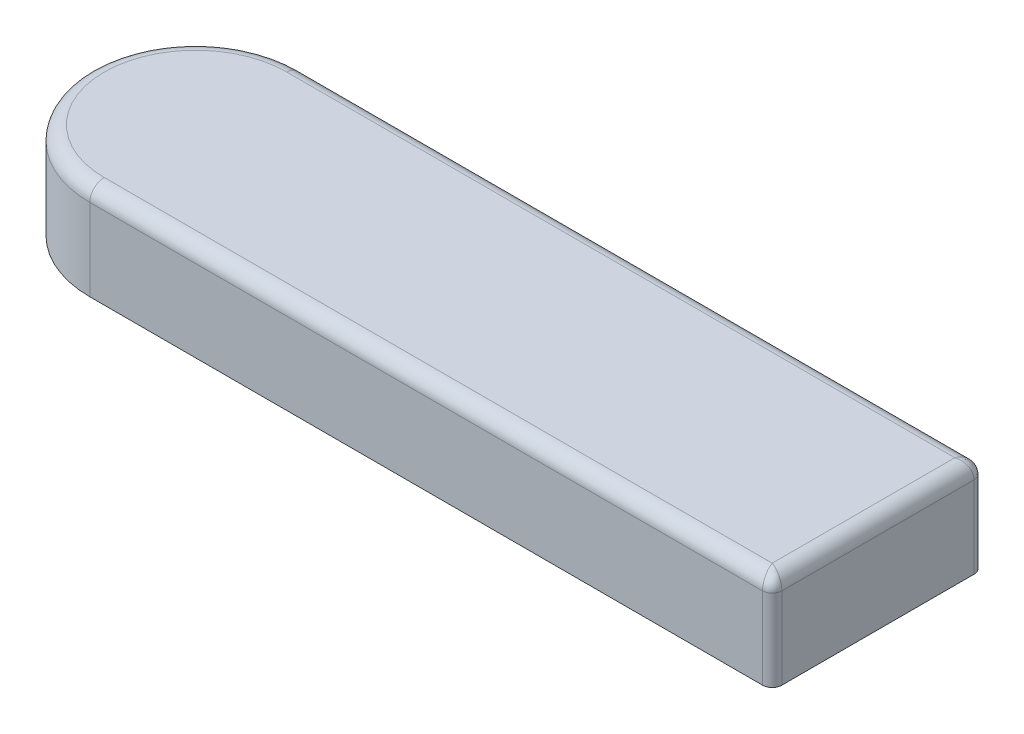
ISO-10303-21;
HEADER;
FILE_DESCRIPTION(('STEP AP214'),'2;1');
FILE_NAME('part.step','',(''),(''),'','','');
FILE_SCHEMA(('AUTOMOTIVE_DESIGN { 1 0 10303 214 1 1 1 1 }'));
ENDSEC;
DATA;
#1=APPLICATION_CONTEXT('core data for automotive mechanical design processes');
#2=APPLICATION_PROTOCOL_DEFINITION('international standard','automotive_design',2000,#1);
#3=PRODUCT_CONTEXT('',#1,'mechanical');
#4=PRODUCT('Part','Part','',(#3));
#5=PRODUCT_RELATED_PRODUCT_CATEGORY('part','',(#4));
#6=PRODUCT_DEFINITION_FORMATION('','',#4);
#7=PRODUCT_DEFINITION_CONTEXT('part definition',#1,'design');
#8=PRODUCT_DEFINITION('design','',#6,#7);
#9=PRODUCT_DEFINITION_SHAPE('','',#8);
#10=(LENGTH_UNIT() NAMED_UNIT(*) SI_UNIT(.MILLI.,.METRE.));
#11=(NAMED_UNIT(*) PLANE_ANGLE_UNIT() SI_UNIT($,.RADIAN.));
#12=(NAMED_UNIT(*) SI_UNIT($,.STERADIAN.) SOLID_ANGLE_UNIT());
#13=UNCERTAINTY_MEASURE_WITH_UNIT(LENGTH_MEASURE(1.E-05),#10,'distance_accuracy_value','');
#14=(GEOMETRIC_REPRESENTATION_CONTEXT(3) GLOBAL_UNCERTAINTY_ASSIGNED_CONTEXT((#13)) GLOBAL_UNIT_ASSIGNED_CONTEXT((#10,
#11,#12)) REPRESENTATION_CONTEXT('',''));
#15=CARTESIAN_POINT('',(0.,0.,0.));
#16=DIRECTION('',(0.,0.,1.));
#17=DIRECTION('',(1.,0.,0.));
#18=AXIS2_PLACEMENT_3D('',#15,#16,#17);
#19=CARTESIAN_POINT('',(0.,10.,0.));
#20=DIRECTION('',(0.,-1.,0.));
#21=DIRECTION('',(0.,0.,-1.));
#22=AXIS2_PLACEMENT_3D('',#19,#20,#21);
#23=CYLINDRICAL_SURFACE('',#22,10.);
#24=DIRECTION('',(0.,-1.,0.));
#25=VECTOR('',#24,1.);
#26=CARTESIAN_POINT('',(0.,10.,-10.));
#27=LINE('',#26,#25);
#28=CARTESIAN_POINT('',(0.,9.,-10.));
#29=VERTEX_POINT('',#28);
#30=CARTESIAN_POINT('',(0.,0.,-10.));
#31=VERTEX_POINT('',#30);
#32=EDGE_CURVE('E160',#29,#31,#27,.T.);
#33=ORIENTED_EDGE('',*,*,#32,.F.);
#34=CARTESIAN_POINT('',(0.,9.,0.));
#35=DIRECTION('',(0.,1.,0.));
#36=DIRECTION('',(0.,0.,1.));
#37=AXIS2_PLACEMENT_3D('',#34,#35,#36);
#38=CIRCLE('',#37,10.);
#39=CARTESIAN_POINT('',(0.,9.,10.));
#40=VERTEX_POINT('',#39);
#41=EDGE_CURVE('E139',#29,#40,#38,.T.);
#42=ORIENTED_EDGE('',*,*,#41,.T.);
#43=DIRECTION('',(0.,-1.,0.));
#44=VECTOR('',#43,1.);
#45=CARTESIAN_POINT('',(0.,10.,10.));
#46=LINE('',#45,#44);
#47=CARTESIAN_POINT('',(0.,0.,10.));
#48=VERTEX_POINT('',#47);
#49=EDGE_CURVE('E162',#40,#48,#46,.T.);
#50=ORIENTED_EDGE('',*,*,#49,.T.);
#51=CARTESIAN_POINT('',(0.,0.,0.));
#52=DIRECTION('',(0.,1.,0.));
#53=DIRECTION('',(0.,0.,1.));
#54=AXIS2_PLACEMENT_3D('',#51,#52,#53);
#55=CIRCLE('',#54,10.);
#56=EDGE_CURVE('E335',#31,#48,#55,.T.);
#57=ORIENTED_EDGE('',*,*,#56,.F.);
#58=EDGE_LOOP('',(#33,#42,#50,#57));
#59=FACE_BOUND('',#58,.T.);
#60=ADVANCED_FACE('F42',(#59),#23,.F.);
#61=CARTESIAN_POINT('',(0.,10.,10.));
#62=DIRECTION('',(0.,0.,-1.));
#63=DIRECTION('',(-1.,0.,0.));
#64=AXIS2_PLACEMENT_3D('',#61,#62,#63);
#65=PLANE('',#64);
#66=ORIENTED_EDGE('',*,*,#49,.F.);
#67=DIRECTION('',(1.,0.,0.));
#68=VECTOR('',#67,1.);
#69=CARTESIAN_POINT('',(0.,9.,10.));
#70=LINE('',#69,#68);
#71=CARTESIAN_POINT('',(70.,9.,10.));
#72=VERTEX_POINT('',#71);
#73=EDGE_CURVE('E153',#40,#72,#70,.T.);
#74=ORIENTED_EDGE('',*,*,#73,.T.);
#75=DIRECTION('',(0.,-1.,0.));
#76=VECTOR('',#75,1.);
#77=CARTESIAN_POINT('',(70.,10.,10.));
#78=LINE('',#77,#76);
#79=CARTESIAN_POINT('',(70.,0.,10.));
#80=VERTEX_POINT('',#79);
#81=EDGE_CURVE('E152',#72,#80,#78,.T.);
#82=ORIENTED_EDGE('',*,*,#81,.T.);
#83=DIRECTION('',(1.,0.,0.));
#84=VECTOR('',#83,1.);
#85=CARTESIAN_POINT('',(0.,0.,10.));
#86=LINE('',#85,#84);
#87=EDGE_CURVE('E338',#48,#80,#86,.T.);
#88=ORIENTED_EDGE('',*,*,#87,.F.);
#89=EDGE_LOOP('',(#66,#74,#82,#88));
#90=FACE_BOUND('',#89,.T.);
#91=ADVANCED_FACE('F270',(#90),#65,.T.);
#92=CARTESIAN_POINT('',(70.,10.,10.));
#93=DIRECTION('',(-1.,0.,0.));
#94=DIRECTION('',(0.,0.,1.));
#95=AXIS2_PLACEMENT_3D('',#92,#93,#94);
#96=PLANE('',#95);
#97=ORIENTED_EDGE('',*,*,#81,.F.);
#98=DIRECTION('',(0.,0.,-1.));
#99=VECTOR('',#98,1.);
#100=CARTESIAN_POINT('',(70.,9.,10.));
#101=LINE('',#100,#99);
#102=CARTESIAN_POINT('',(70.,9.,-10.));
#103=VERTEX_POINT('',#102);
#104=EDGE_CURVE('E136',#72,#103,#101,.T.);
#105=ORIENTED_EDGE('',*,*,#104,.T.);
#106=DIRECTION('',(0.,-1.,0.));
#107=VECTOR('',#106,1.);
#108=CARTESIAN_POINT('',(70.,10.,-10.));
#109=LINE('',#108,#107);
#110=CARTESIAN_POINT('',(70.,0.,-10.));
#111=VERTEX_POINT('',#110);
#112=EDGE_CURVE('E150',#103,#111,#109,.T.);
#113=ORIENTED_EDGE('',*,*,#112,.T.);
#114=DIRECTION('',(0.,0.,-1.));
#115=VECTOR('',#114,1.);
#116=CARTESIAN_POINT('',(70.,0.,10.));
#117=LINE('',#116,#115);
#118=EDGE_CURVE('E341',#80,#111,#117,.T.);
#119=ORIENTED_EDGE('',*,*,#118,.F.);
#120=EDGE_LOOP('',(#97,#105,#113,#119));
#121=FACE_BOUND('',#120,.T.);
#122=ADVANCED_FACE('F148',(#121),#96,.T.);
#123=CARTESIAN_POINT('',(0.,10.,-10.));
#124=DIRECTION('',(0.,0.,1.));
#125=DIRECTION('',(1.,0.,0.));
#126=AXIS2_PLACEMENT_3D('',#123,#124,#125);
#127=PLANE('',#126);
#128=ORIENTED_EDGE('',*,*,#112,.F.);
#129=DIRECTION('',(-1.,0.,0.));
#130=VECTOR('',#129,1.);
#131=CARTESIAN_POINT('',(0.,9.,-10.));
#132=LINE('',#131,#130);
#133=EDGE_CURVE('E133',#103,#29,#132,.T.);
#134=ORIENTED_EDGE('',*,*,#133,.T.);
#135=ORIENTED_EDGE('',*,*,#32,.T.);
#136=DIRECTION('',(-1.,0.,0.));
#137=VECTOR('',#136,1.);
#138=CARTESIAN_POINT('',(0.,0.,-10.));
#139=LINE('',#138,#137);
#140=EDGE_CURVE('E158',#111,#31,#139,.T.);
#141=ORIENTED_EDGE('',*,*,#140,.F.);
#142=EDGE_LOOP('',(#128,#134,#135,#141));
#143=FACE_BOUND('',#142,.T.);
#144=ADVANCED_FACE('F156',(#143),#127,.T.);
#145=CARTESIAN_POINT('',(0.,10.,0.));
#146=DIRECTION('',(0.,1.,0.));
#147=DIRECTION('',(0.,0.,1.));
#148=AXIS2_PLACEMENT_3D('',#145,#146,#147);
#149=PLANE('',#148);
#150=DIRECTION('',(0.,0.,-1.));
#151=VECTOR('',#150,1.);
#152=CARTESIAN_POINT('',(69.5,10.,-11.));
#153=LINE('',#152,#151);
#154=CARTESIAN_POINT('',(69.5,10.,9.5));
#155=VERTEX_POINT('',#154);
#156=CARTESIAN_POINT('',(69.5,10.,-9.5));
#157=VERTEX_POINT('',#156);
#158=EDGE_CURVE('E183',#155,#157,#153,.T.);
#159=ORIENTED_EDGE('',*,*,#158,.T.);
#160=DIRECTION('',(-1.,0.,0.));
#161=VECTOR('',#160,1.);
#162=CARTESIAN_POINT('',(0.,10.,-9.5));
#163=LINE('',#162,#161);
#164=CARTESIAN_POINT('',(0.,10.,-9.5));
#165=VERTEX_POINT('',#164);
#166=EDGE_CURVE('E188',#157,#165,#163,.T.);
#167=ORIENTED_EDGE('',*,*,#166,.T.);
#168=CARTESIAN_POINT('',(0.,10.,0.));
#169=DIRECTION('',(0.,1.,0.));
#170=DIRECTION('',(0.,0.,1.));
#171=AXIS2_PLACEMENT_3D('',#168,#169,#170);
#172=CIRCLE('',#171,9.5);
#173=CARTESIAN_POINT('',(0.,10.,9.5));
#174=VERTEX_POINT('',#173);
#175=EDGE_CURVE('E186',#165,#174,#172,.T.);
#176=ORIENTED_EDGE('',*,*,#175,.T.);
#177=DIRECTION('',(1.,0.,0.));
#178=VECTOR('',#177,1.);
#179=CARTESIAN_POINT('',(71.,10.,9.5));
#180=LINE('',#179,#178);
#181=EDGE_CURVE('E143',#174,#155,#180,.T.);
#182=ORIENTED_EDGE('',*,*,#181,.T.);
#183=EDGE_LOOP('',(#159,#167,#176,#182));
#184=FACE_BOUND('',#183,.T.);
#185=ADVANCED_FACE('F280',(#184),#149,.T.);
#186=CARTESIAN_POINT('',(0.,0.,0.));
#187=DIRECTION('',(0.,1.,0.));
#188=DIRECTION('',(0.,0.,1.));
#189=AXIS2_PLACEMENT_3D('',#186,#187,#188);
#190=PLANE('',#189);
#191=DIRECTION('',(-1.,0.,0.));
#192=VECTOR('',#191,1.);
#193=CARTESIAN_POINT('',(0.,0.,-11.));
#194=LINE('',#193,#192);
#195=CARTESIAN_POINT('',(70.,0.,-11.));
#196=VERTEX_POINT('',#195);
#197=CARTESIAN_POINT('',(0.,0.,-11.));
#198=VERTEX_POINT('',#197);
#199=EDGE_CURVE('E175',#196,#198,#194,.T.);
#200=ORIENTED_EDGE('',*,*,#199,.F.);
#201=CARTESIAN_POINT('',(70.,0.,-10.));
#202=DIRECTION('',(0.,1.,0.));
#203=DIRECTION('',(0.,0.,1.));
#204=AXIS2_PLACEMENT_3D('',#201,#202,#203);
#205=CIRCLE('',#204,1.);
#206=CARTESIAN_POINT('',(71.,0.,-10.));
#207=VERTEX_POINT('',#206);
#208=EDGE_CURVE('E64',#196,#207,#205,.F.);
#209=ORIENTED_EDGE('',*,*,#208,.T.);
#210=DIRECTION('',(0.,0.,-1.));
#211=VECTOR('',#210,1.);
#212=CARTESIAN_POINT('',(71.,0.,-11.));
#213=LINE('',#212,#211);
#214=CARTESIAN_POINT('',(71.,0.,10.));
#215=VERTEX_POINT('',#214);
#216=EDGE_CURVE('E173',#215,#207,#213,.T.);
#217=ORIENTED_EDGE('',*,*,#216,.F.);
#218=CARTESIAN_POINT('',(70.,0.,10.));
#219=DIRECTION('',(0.,1.,0.));
#220=DIRECTION('',(0.,0.,1.));
#221=AXIS2_PLACEMENT_3D('',#218,#219,#220);
#222=CIRCLE('',#221,1.);
#223=CARTESIAN_POINT('',(70.,0.,11.));
#224=VERTEX_POINT('',#223);
#225=EDGE_CURVE('E58',#215,#224,#222,.F.);
#226=ORIENTED_EDGE('',*,*,#225,.T.);
#227=DIRECTION('',(1.,0.,0.));
#228=VECTOR('',#227,1.);
#229=CARTESIAN_POINT('',(0.,0.,11.));
#230=LINE('',#229,#228);
#231=CARTESIAN_POINT('',(0.,0.,11.));
#232=VERTEX_POINT('',#231);
#233=EDGE_CURVE('E171',#232,#224,#230,.T.);
#234=ORIENTED_EDGE('',*,*,#233,.F.);
#235=CARTESIAN_POINT('',(0.,0.,0.));
#236=DIRECTION('',(0.,1.,0.));
#237=DIRECTION('',(0.,0.,1.));
#238=AXIS2_PLACEMENT_3D('',#235,#236,#237);
#239=CIRCLE('',#238,11.);
#240=EDGE_CURVE('E168',#198,#232,#239,.T.);
#241=ORIENTED_EDGE('',*,*,#240,.F.);
#242=EDGE_LOOP('',(#200,#209,#217,#226,#234,#241));
#243=FACE_BOUND('',#242,.T.);
#244=ORIENTED_EDGE('',*,*,#56,.T.);
#245=ORIENTED_EDGE('',*,*,#87,.T.);
#246=ORIENTED_EDGE('',*,*,#118,.T.);
#247=ORIENTED_EDGE('',*,*,#140,.T.);
#248=EDGE_LOOP('',(#244,#245,#246,#247));
#249=FACE_BOUND('',#248,.T.);
#250=ADVANCED_FACE('F283',(#243,#249),#190,.F.);
#251=CARTESIAN_POINT('',(0.,10.,0.));
#252=DIRECTION('',(0.,-1.,0.));
#253=DIRECTION('',(0.,0.,-1.));
#254=AXIS2_PLACEMENT_3D('',#251,#252,#253);
#255=CYLINDRICAL_SURFACE('',#254,11.);
#256=DIRECTION('',(0.,-1.,0.));
#257=VECTOR('',#256,1.);
#258=CARTESIAN_POINT('',(0.,10.,11.));
#259=LINE('',#258,#257);
#260=CARTESIAN_POINT('',(0.,8.5,11.));
#261=VERTEX_POINT('',#260);
#262=EDGE_CURVE('E144',#261,#232,#259,.T.);
#263=ORIENTED_EDGE('',*,*,#262,.F.);
#264=CARTESIAN_POINT('',(0.,8.5,0.));
#265=DIRECTION('',(0.,1.,0.));
#266=DIRECTION('',(0.,0.,1.));
#267=AXIS2_PLACEMENT_3D('',#264,#265,#266);
#268=CIRCLE('',#267,11.);
#269=CARTESIAN_POINT('',(0.,8.5,-11.));
#270=VERTEX_POINT('',#269);
#271=EDGE_CURVE('E194',#261,#270,#268,.F.);
#272=ORIENTED_EDGE('',*,*,#271,.T.);
#273=DIRECTION('',(0.,-1.,0.));
#274=VECTOR('',#273,1.);
#275=CARTESIAN_POINT('',(0.,10.,-11.));
#276=LINE('',#275,#274);
#277=EDGE_CURVE('E177',#270,#198,#276,.T.);
#278=ORIENTED_EDGE('',*,*,#277,.T.);
#279=ORIENTED_EDGE('',*,*,#240,.T.);
#280=EDGE_LOOP('',(#263,#272,#278,#279));
#281=FACE_BOUND('',#280,.T.);
#282=ADVANCED_FACE('F287',(#281),#255,.T.);
#283=CARTESIAN_POINT('',(0.,10.,11.));
#284=DIRECTION('',(0.,0.,-1.));
#285=DIRECTION('',(-1.,0.,0.));
#286=AXIS2_PLACEMENT_3D('',#283,#284,#285);
#287=PLANE('',#286);
#288=ORIENTED_EDGE('',*,*,#233,.T.);
#289=DIRECTION('',(0.,-1.,0.));
#290=VECTOR('',#289,1.);
#291=CARTESIAN_POINT('',(70.,10.,11.));
#292=LINE('',#291,#290);
#293=CARTESIAN_POINT('',(70.,8.5,11.));
#294=VERTEX_POINT('',#293);
#295=EDGE_CURVE('E224',#224,#294,#292,.F.);
#296=ORIENTED_EDGE('',*,*,#295,.T.);
#297=DIRECTION('',(1.,0.,0.));
#298=VECTOR('',#297,1.);
#299=CARTESIAN_POINT('',(0.,8.5,11.));
#300=LINE('',#299,#298);
#301=EDGE_CURVE('E199',#294,#261,#300,.F.);
#302=ORIENTED_EDGE('',*,*,#301,.T.);
#303=ORIENTED_EDGE('',*,*,#262,.T.);
#304=EDGE_LOOP('',(#288,#296,#302,#303));
#305=FACE_BOUND('',#304,.T.);
#306=ADVANCED_FACE('F295',(#305),#287,.F.);
#307=CARTESIAN_POINT('',(71.,10.,-11.));
#308=DIRECTION('',(-1.,0.,0.));
#309=DIRECTION('',(0.,0.,1.));
#310=AXIS2_PLACEMENT_3D('',#307,#308,#309);
#311=PLANE('',#310);
#312=ORIENTED_EDGE('',*,*,#216,.T.);
#313=DIRECTION('',(0.,-1.,0.));
#314=VECTOR('',#313,1.);
#315=CARTESIAN_POINT('',(71.,10.,-10.));
#316=LINE('',#315,#314);
#317=CARTESIAN_POINT('',(71.,8.5,-10.));
#318=VERTEX_POINT('',#317);
#319=EDGE_CURVE('E222',#207,#318,#316,.F.);
#320=ORIENTED_EDGE('',*,*,#319,.T.);
#321=DIRECTION('',(0.,0.,-1.));
#322=VECTOR('',#321,1.);
#323=CARTESIAN_POINT('',(71.,8.5,11.));
#324=LINE('',#323,#322);
#325=CARTESIAN_POINT('',(71.,8.5,10.));
#326=VERTEX_POINT('',#325);
#327=EDGE_CURVE('E196',#318,#326,#324,.F.);
#328=ORIENTED_EDGE('',*,*,#327,.T.);
#329=DIRECTION('',(0.,-1.,0.));
#330=VECTOR('',#329,1.);
#331=CARTESIAN_POINT('',(71.,10.,10.));
#332=LINE('',#331,#330);
#333=EDGE_CURVE('E220',#326,#215,#332,.T.);
#334=ORIENTED_EDGE('',*,*,#333,.T.);
#335=EDGE_LOOP('',(#312,#320,#328,#334));
#336=FACE_BOUND('',#335,.T.);
#337=ADVANCED_FACE('F291',(#336),#311,.F.);
#338=CARTESIAN_POINT('',(0.,10.,-11.));
#339=DIRECTION('',(0.,0.,1.));
#340=DIRECTION('',(1.,0.,0.));
#341=AXIS2_PLACEMENT_3D('',#338,#339,#340);
#342=PLANE('',#341);
#343=DIRECTION('',(-1.,0.,0.));
#344=VECTOR('',#343,1.);
#345=CARTESIAN_POINT('',(71.,8.5,-11.));
#346=LINE('',#345,#344);
#347=CARTESIAN_POINT('',(70.,8.5,-11.));
#348=VERTEX_POINT('',#347);
#349=EDGE_CURVE('E191',#270,#348,#346,.F.);
#350=ORIENTED_EDGE('',*,*,#349,.T.);
#351=DIRECTION('',(0.,-1.,0.));
#352=VECTOR('',#351,1.);
#353=CARTESIAN_POINT('',(70.,10.,-11.));
#354=LINE('',#353,#352);
#355=EDGE_CURVE('E216',#348,#196,#354,.T.);
#356=ORIENTED_EDGE('',*,*,#355,.T.);
#357=ORIENTED_EDGE('',*,*,#199,.T.);
#358=ORIENTED_EDGE('',*,*,#277,.F.);
#359=EDGE_LOOP('',(#350,#356,#357,#358));
#360=FACE_BOUND('',#359,.T.);
#361=ADVANCED_FACE('F288',(#360),#342,.F.);
#362=CARTESIAN_POINT('',(0.,9.,0.));
#363=DIRECTION('',(0.,1.,0.));
#364=DIRECTION('',(0.,0.,1.));
#365=AXIS2_PLACEMENT_3D('',#362,#363,#364);
#366=PLANE('',#365);
#367=CARTESIAN_POINT('',(58.57,9.,0.));
#368=DIRECTION('',(0.,1.,0.));
#369=DIRECTION('',(0.,0.,1.));
#370=AXIS2_PLACEMENT_3D('',#367,#368,#369);
#371=CIRCLE('',#370,7.50000000000001);
#372=CARTESIAN_POINT('',(58.57,9.,7.50000000000001));
#373=VERTEX_POINT('',#372);
#374=EDGE_CURVE('E46',#373,#373,#371,.F.);
#375=ORIENTED_EDGE('',*,*,#374,.F.);
#376=EDGE_LOOP('',(#375));
#377=FACE_BOUND('',#376,.T.);
#378=ORIENTED_EDGE('',*,*,#41,.F.);
#379=ORIENTED_EDGE('',*,*,#133,.F.);
#380=ORIENTED_EDGE('',*,*,#104,.F.);
#381=ORIENTED_EDGE('',*,*,#73,.F.);
#382=EDGE_LOOP('',(#378,#379,#380,#381));
#383=FACE_BOUND('',#382,.T.);
#384=ADVANCED_FACE('F135',(#377,#383),#366,.F.);
#385=CARTESIAN_POINT('',(0.,8.5,9.5));
#386=DIRECTION('',(-1.,0.,0.));
#387=DIRECTION('',(0.,0.,1.));
#388=AXIS2_PLACEMENT_3D('',#385,#386,#387);
#389=CYLINDRICAL_SURFACE('',#388,1.5);
#390=ORIENTED_EDGE('',*,*,#301,.F.);
#391=CARTESIAN_POINT('',(69.5,8.5,9.5));
#392=DIRECTION('',(0.948683298050513,0.,-0.316227766016838));
#393=DIRECTION('',(0.316227766016838,0.,0.948683298050514));
#394=AXIS2_PLACEMENT_3D('',#391,#392,#393);
#395=ELLIPSE('',#394,1.58113883008419,1.5);
#396=EDGE_CURVE('E214',#294,#155,#395,.F.);
#397=ORIENTED_EDGE('',*,*,#396,.T.);
#398=ORIENTED_EDGE('',*,*,#181,.F.);
#399=CARTESIAN_POINT('',(0.,8.5,9.5));
#400=DIRECTION('',(-1.,0.,0.));
#401=DIRECTION('',(0.,-1.,0.));
#402=AXIS2_PLACEMENT_3D('',#399,#400,#401);
#403=CIRCLE('',#402,1.5);
#404=EDGE_CURVE('E154',#261,#174,#403,.T.);
#405=ORIENTED_EDGE('',*,*,#404,.F.);
#406=EDGE_LOOP('',(#390,#397,#398,#405));
#407=FACE_BOUND('',#406,.T.);
#408=ADVANCED_FACE('F241',(#407),#389,.T.);
#409=CARTESIAN_POINT('',(69.5,8.5,0.));
#410=DIRECTION('',(0.,0.,1.));
#411=DIRECTION('',(1.,0.,0.));
#412=AXIS2_PLACEMENT_3D('',#409,#410,#411);
#413=CYLINDRICAL_SURFACE('',#412,1.5);
#414=ORIENTED_EDGE('',*,*,#327,.F.);
#415=CARTESIAN_POINT('',(69.5,8.5,-9.5));
#416=DIRECTION('',(-0.316227766016838,0.,-0.948683298050514));
#417=DIRECTION('',(0.948683298050514,0.,-0.316227766016838));
#418=AXIS2_PLACEMENT_3D('',#415,#416,#417);
#419=ELLIPSE('',#418,1.58113883008419,1.5);
#420=EDGE_CURVE('E212',#318,#157,#419,.F.);
#421=ORIENTED_EDGE('',*,*,#420,.T.);
#422=ORIENTED_EDGE('',*,*,#158,.F.);
#423=CARTESIAN_POINT('',(69.5,8.5,9.5));
#424=DIRECTION('',(0.316227766016838,0.,-0.948683298050514));
#425=DIRECTION('',(0.948683298050514,0.,0.316227766016838));
#426=AXIS2_PLACEMENT_3D('',#423,#424,#425);
#427=ELLIPSE('',#426,1.58113883008419,1.5);
#428=EDGE_CURVE('E209',#155,#326,#427,.T.);
#429=ORIENTED_EDGE('',*,*,#428,.T.);
#430=EDGE_LOOP('',(#414,#421,#422,#429));
#431=FACE_BOUND('',#430,.T.);
#432=ADVANCED_FACE('F247',(#431),#413,.T.);
#433=CARTESIAN_POINT('',(0.,8.5,0.));
#434=DIRECTION('',(0.,1.,0.));
#435=DIRECTION('',(0.,0.,1.));
#436=AXIS2_PLACEMENT_3D('',#433,#434,#435);
#437=TOROIDAL_SURFACE('',#436,9.5,1.5);
#438=ORIENTED_EDGE('',*,*,#404,.T.);
#439=ORIENTED_EDGE('',*,*,#175,.F.);
#440=CARTESIAN_POINT('',(0.,8.5,-9.5));
#441=DIRECTION('',(1.,0.,0.));
#442=DIRECTION('',(0.,0.,-1.));
#443=AXIS2_PLACEMENT_3D('',#440,#441,#442);
#444=CIRCLE('',#443,1.5);
#445=EDGE_CURVE('E202',#270,#165,#444,.T.);
#446=ORIENTED_EDGE('',*,*,#445,.F.);
#447=ORIENTED_EDGE('',*,*,#271,.F.);
#448=EDGE_LOOP('',(#438,#439,#446,#447));
#449=FACE_BOUND('',#448,.T.);
#450=ADVANCED_FACE('F250',(#449),#437,.T.);
#451=CARTESIAN_POINT('',(0.,8.5,-9.5));
#452=DIRECTION('',(1.,0.,0.));
#453=DIRECTION('',(0.,0.,-1.));
#454=AXIS2_PLACEMENT_3D('',#451,#452,#453);
#455=CYLINDRICAL_SURFACE('',#454,1.5);
#456=ORIENTED_EDGE('',*,*,#166,.F.);
#457=CARTESIAN_POINT('',(69.5,8.5,-9.5));
#458=DIRECTION('',(-0.948683298050513,0.,-0.316227766016838));
#459=DIRECTION('',(0.316227766016838,0.,-0.948683298050514));
#460=AXIS2_PLACEMENT_3D('',#457,#458,#459);
#461=ELLIPSE('',#460,1.58113883008419,1.5);
#462=EDGE_CURVE('E201',#157,#348,#461,.T.);
#463=ORIENTED_EDGE('',*,*,#462,.T.);
#464=ORIENTED_EDGE('',*,*,#349,.F.);
#465=ORIENTED_EDGE('',*,*,#445,.T.);
#466=EDGE_LOOP('',(#456,#463,#464,#465));
#467=FACE_BOUND('',#466,.T.);
#468=ADVANCED_FACE('F243',(#467),#455,.T.);
#469=CARTESIAN_POINT('',(70.,10.,-10.));
#470=DIRECTION('',(0.,-1.,0.));
#471=DIRECTION('',(0.,0.,-1.));
#472=AXIS2_PLACEMENT_3D('',#469,#470,#471);
#473=CYLINDRICAL_SURFACE('',#472,1.);
#474=ORIENTED_EDGE('',*,*,#208,.F.);
#475=ORIENTED_EDGE('',*,*,#355,.F.);
#476=CARTESIAN_POINT('',(70.,8.5,-10.));
#477=DIRECTION('',(0.,1.,0.));
#478=DIRECTION('',(0.,0.,1.));
#479=AXIS2_PLACEMENT_3D('',#476,#477,#478);
#480=CIRCLE('',#479,1.);
#481=EDGE_CURVE('E204',#318,#348,#480,.T.);
#482=ORIENTED_EDGE('',*,*,#481,.F.);
#483=ORIENTED_EDGE('',*,*,#319,.F.);
#484=EDGE_LOOP('',(#474,#475,#482,#483));
#485=FACE_BOUND('',#484,.T.);
#486=ADVANCED_FACE('F239',(#485),#473,.T.);
#487=CARTESIAN_POINT('',(69.5,7.,-9.5));
#488=CARTESIAN_POINT('',(69.5,7.,-9.5));
#489=CARTESIAN_POINT('',(69.5,7.,-9.5));
#490=CARTESIAN_POINT('',(69.5217823735519,7.00002629143751,-9.56534712065569));
#491=CARTESIAN_POINT('',(69.5435728143365,7.00004019665682,-9.54357281433653));
#492=CARTESIAN_POINT('',(69.5653471206557,7.00002629143751,-9.5217823735519));
#493=CARTESIAN_POINT('',(69.5435703088954,7.00427236557313,-9.63071092668624));
#494=CARTESIAN_POINT('',(69.5872665803194,7.00142852337514,-9.58726658031936));
#495=CARTESIAN_POINT('',(69.6307109266862,7.00427236557313,-9.54357030889541));
#496=CARTESIAN_POINT('',(69.5867714969681,7.02132028831667,-9.76031449090427));
#497=CARTESIAN_POINT('',(69.674782714425,7.00719223269811,-9.67478271442495));
#498=CARTESIAN_POINT('',(69.7603144909043,7.02132028831668,-9.58677149696809));
#499=CARTESIAN_POINT('',(69.6081863603207,7.03404910699136,-9.82455908096205));
#500=CARTESIAN_POINT('',(69.7188522333018,7.01157542738237,-9.71885223330176));
#501=CARTESIAN_POINT('',(69.8245590809621,7.03404910699136,-9.60818636032069));
#502=CARTESIAN_POINT('',(69.6502767096491,7.06788723141722,-9.95083012894728));
#503=CARTESIAN_POINT('',(69.8075048536816,7.02366590745903,-9.80750485368162));
#504=CARTESIAN_POINT('',(69.9508301289473,7.06788723141722,-9.65027670964909));
#505=CARTESIAN_POINT('',(69.6709585724816,7.08885239061663,-10.0128757174448));
#506=CARTESIAN_POINT('',(69.8523318832769,7.03138816939872,-9.85233188327694));
#507=CARTESIAN_POINT('',(70.0128757174448,7.08885239061663,-9.67095857248161));
#508=CARTESIAN_POINT('',(69.7112227334933,7.13888506426985,-10.13366820048));
#509=CARTESIAN_POINT('',(69.9428936210717,7.05090326474452,-9.9428936210717));
#510=CARTESIAN_POINT('',(70.13366820048,7.13888506426985,-9.71122273349334));
#511=CARTESIAN_POINT('',(69.7308195679233,7.16774025933576,-10.19245870377));
#512=CARTESIAN_POINT('',(69.9888635766674,7.06271478363326,-9.9888635766674));
#513=CARTESIAN_POINT('',(70.19245870377,7.16774025933576,-9.73081956792333));
#514=CARTESIAN_POINT('',(69.76856991767,7.23312608249779,-10.3057097530099));
#515=CARTESIAN_POINT('',(70.0820627393204,7.09161741746887,-10.0820627393204));
#516=CARTESIAN_POINT('',(70.3057097530099,7.2331260824978,-9.76856991766997));
#517=CARTESIAN_POINT('',(69.7867495193356,7.26938316632966,-10.3602485580067));
#518=CARTESIAN_POINT('',(70.1295106306281,7.10872415201272,-10.1295106306281));
#519=CARTESIAN_POINT('',(70.3602485580067,7.26938316632967,-9.78674951933556));
#520=CARTESIAN_POINT('',(69.8213420383227,7.34901477609246,-10.4640261149682));
#521=CARTESIAN_POINT('',(70.22584714471,7.15007114450488,-10.22584714471));
#522=CARTESIAN_POINT('',(70.4640261149682,7.34901477609247,-9.82134203832273));
#523=CARTESIAN_POINT('',(69.8377958358128,7.39206654786685,-10.5133875074385));
#524=CARTESIAN_POINT('',(70.2749250131566,7.17430962593363,-10.2749250131566));
#525=CARTESIAN_POINT('',(70.5133875074385,7.39206654786685,-9.83779583581282));
#526=CARTESIAN_POINT('',(69.8686396401377,7.4845991666221,-10.6059189204132));
#527=CARTESIAN_POINT('',(70.3742724272084,7.23254441323452,-10.3742724272084));
#528=CARTESIAN_POINT('',(70.6059189204132,7.48459916662209,-9.86863964013773));
#529=CARTESIAN_POINT('',(69.883087706164,7.53372798496215,-10.649263118492));
#530=CARTESIAN_POINT('',(70.4246835962108,7.26649448382186,-10.4246835962108));
#531=CARTESIAN_POINT('',(70.649263118492,7.53372798496215,-9.883087706164));
#532=CARTESIAN_POINT('',(69.9096548366656,7.63759964377597,-10.7289645099968));
#533=CARTESIAN_POINT('',(70.5255819710409,7.34748701780004,-10.5255819710409));
#534=CARTESIAN_POINT('',(70.7289645099968,7.63759964377597,-9.90965483666561));
#535=CARTESIAN_POINT('',(69.9218493954006,7.69199088859271,-10.7655481862017));
#536=CARTESIAN_POINT('',(70.5761414544634,7.39439180670888,-10.5761414544634));
#537=CARTESIAN_POINT('',(70.7655481862017,7.69199088859272,-9.92184939540055));
#538=CARTESIAN_POINT('',(69.9436829907165,7.80544718973898,-10.8310489721496));
#539=CARTESIAN_POINT('',(70.6747885217409,7.50478447762643,-10.6747885217409));
#540=CARTESIAN_POINT('',(70.8310489721496,7.80544718973898,-9.94368299071653));
#541=CARTESIAN_POINT('',(69.9534111045777,7.86419974278135,-10.8602333137332));
#542=CARTESIAN_POINT('',(70.7228613759303,7.56797143857374,-10.7228613759303));
#543=CARTESIAN_POINT('',(70.8602333137332,7.86419974278134,-9.95341110457774));
#544=CARTESIAN_POINT('',(69.9701326318778,7.98531771006845,-10.9103978956334));
#545=CARTESIAN_POINT('',(70.8121547575071,7.71318638085784,-10.8121547575072));
#546=CARTESIAN_POINT('',(70.9103978956334,7.98531771006845,-9.97013263187781));
#547=CARTESIAN_POINT('',(69.9772186371533,8.04744979781569,-10.9316559114598));
#548=CARTESIAN_POINT('',(70.8532760697352,7.79466202463433,-10.8532760697352));
#549=CARTESIAN_POINT('',(70.9316559114598,8.04744979781569,-9.97721863715327));
#550=CARTESIAN_POINT('',(69.9885347087233,8.17416171433211,-10.9656041261701));
#551=CARTESIAN_POINT('',(70.9228683074525,7.97533536040442,-10.9228683074526));
#552=CARTESIAN_POINT('',(70.96560412617,8.17416171433211,-9.98853470872335));
#553=CARTESIAN_POINT('',(69.992844140155,8.23861202839033,-10.9785324204649));
#554=CARTESIAN_POINT('',(70.9511972894264,8.07366462123912,-10.9511972894264));
#555=CARTESIAN_POINT('',(70.9785324204649,8.23861202839033,-9.99284414015497));
#556=CARTESIAN_POINT('',(69.9985534982464,8.3687331433414,-10.9956604947392));
#557=CARTESIAN_POINT('',(70.9898159733385,8.28188671940045,-10.9898159733385));
#558=CARTESIAN_POINT('',(70.9956604947392,8.3687331433414,-9.99855349824639));
#559=CARTESIAN_POINT('',(70.,8.4343665716707,-11.));
#560=CARTESIAN_POINT('',(71.,8.39062512198593,-11.));
#561=CARTESIAN_POINT('',(71.,8.4343665716707,-10.));
#562=CARTESIAN_POINT('',(70.,8.5656334283293,-11.));
#563=CARTESIAN_POINT('',(71.,8.60937487801407,-11.));
#564=CARTESIAN_POINT('',(71.,8.5656334283293,-10.));
#565=CARTESIAN_POINT('',(69.9985534982464,8.6312668566586,-10.9956604947392));
#566=CARTESIAN_POINT('',(70.9898159733385,8.71811328059956,-10.9898159733385));
#567=CARTESIAN_POINT('',(70.9956604947392,8.63126685665861,-9.99855349824639));
#568=CARTESIAN_POINT('',(69.992844140155,8.76138797160967,-10.9785324204649));
#569=CARTESIAN_POINT('',(70.9511972894264,8.92633537876088,-10.9511972894264));
#570=CARTESIAN_POINT('',(70.9785324204649,8.76138797160967,-9.99284414015497));
#571=CARTESIAN_POINT('',(69.9885347087233,8.82583828566789,-10.9656041261701));
#572=CARTESIAN_POINT('',(70.9228683074526,9.02466463959557,-10.9228683074526));
#573=CARTESIAN_POINT('',(70.96560412617,8.82583828566789,-9.98853470872335));
#574=CARTESIAN_POINT('',(69.9772186371533,8.95255020218431,-10.9316559114598));
#575=CARTESIAN_POINT('',(70.8532760697352,9.20533797536566,-10.8532760697352));
#576=CARTESIAN_POINT('',(70.9316559114598,8.95255020218431,-9.97721863715327));
#577=CARTESIAN_POINT('',(69.9701326318778,9.01468228993155,-10.9103978956334));
#578=CARTESIAN_POINT('',(70.8121547575071,9.28681361914216,-10.8121547575072));
#579=CARTESIAN_POINT('',(70.9103978956334,9.01468228993155,-9.97013263187781));
#580=CARTESIAN_POINT('',(69.9534111045777,9.13580025721865,-10.8602333137332));
#581=CARTESIAN_POINT('',(70.7228613759303,9.43202856142627,-10.7228613759303));
#582=CARTESIAN_POINT('',(70.8602333137332,9.13580025721866,-9.95341110457774));
#583=CARTESIAN_POINT('',(69.9436829907165,9.19455281026102,-10.8310489721496));
#584=CARTESIAN_POINT('',(70.6747885217409,9.49521552237357,-10.6747885217409));
#585=CARTESIAN_POINT('',(70.8310489721496,9.19455281026102,-9.94368299071653));
#586=CARTESIAN_POINT('',(69.9218493954006,9.30800911140729,-10.7655481862017));
#587=CARTESIAN_POINT('',(70.5761414544634,9.60560819329112,-10.5761414544634));
#588=CARTESIAN_POINT('',(70.7655481862017,9.30800911140729,-9.92184939540055));
#589=CARTESIAN_POINT('',(69.9096548366656,9.36240035622404,-10.7289645099968));
#590=CARTESIAN_POINT('',(70.5255819710409,9.65251298219996,-10.5255819710409));
#591=CARTESIAN_POINT('',(70.7289645099968,9.36240035622403,-9.90965483666561));
#592=CARTESIAN_POINT('',(69.883087706164,9.46627201503785,-10.649263118492));
#593=CARTESIAN_POINT('',(70.4246835962108,9.73350551617814,-10.4246835962108));
#594=CARTESIAN_POINT('',(70.649263118492,9.46627201503785,-9.883087706164));
#595=CARTESIAN_POINT('',(69.8686396401377,9.5154008333779,-10.6059189204132));
#596=CARTESIAN_POINT('',(70.3742724272084,9.76745558676548,-10.3742724272084));
#597=CARTESIAN_POINT('',(70.6059189204132,9.51540083337791,-9.86863964013773));
#598=CARTESIAN_POINT('',(69.8377958358128,9.60793345213315,-10.5133875074385));
#599=CARTESIAN_POINT('',(70.2749250131566,9.82569037406637,-10.2749250131566));
#600=CARTESIAN_POINT('',(70.5133875074385,9.60793345213316,-9.83779583581282));
#601=CARTESIAN_POINT('',(69.8213420383227,9.65098522390754,-10.4640261149682));
#602=CARTESIAN_POINT('',(70.22584714471,9.84992885549512,-10.22584714471));
#603=CARTESIAN_POINT('',(70.4640261149682,9.65098522390754,-9.82134203832273));
#604=CARTESIAN_POINT('',(69.7867495193356,9.73061683367034,-10.3602485580067));
#605=CARTESIAN_POINT('',(70.1295106306281,9.89127584798728,-10.1295106306281));
#606=CARTESIAN_POINT('',(70.3602485580067,9.73061683367033,-9.78674951933556));
#607=CARTESIAN_POINT('',(69.76856991767,9.76687391750221,-10.3057097530099));
#608=CARTESIAN_POINT('',(70.0820627393204,9.90838258253113,-10.0820627393204));
#609=CARTESIAN_POINT('',(70.3057097530099,9.7668739175022,-9.76856991766997));
#610=CARTESIAN_POINT('',(69.7308195679233,9.83225974066424,-10.19245870377));
#611=CARTESIAN_POINT('',(69.9888635766674,9.93728521636674,-9.9888635766674));
#612=CARTESIAN_POINT('',(70.19245870377,9.83225974066424,-9.73081956792333));
#613=CARTESIAN_POINT('',(69.7112227334933,9.86111493573015,-10.13366820048));
#614=CARTESIAN_POINT('',(69.9428936210717,9.94909673525548,-9.9428936210717));
#615=CARTESIAN_POINT('',(70.13366820048,9.86111493573016,-9.71122273349334));
#616=CARTESIAN_POINT('',(69.6709585724816,9.91114760938337,-10.0128757174448));
#617=CARTESIAN_POINT('',(69.8523318832769,9.96861183060128,-9.85233188327694));
#618=CARTESIAN_POINT('',(70.0128757174448,9.91114760938337,-9.67095857248161));
#619=CARTESIAN_POINT('',(69.6502767096491,9.93211276858278,-9.95083012894728));
#620=CARTESIAN_POINT('',(69.8075048536816,9.97633409254098,-9.80750485368162));
#621=CARTESIAN_POINT('',(69.9508301289473,9.93211276858278,-9.65027670964909));
#622=CARTESIAN_POINT('',(69.6081863603207,9.96595089300865,-9.82455908096205));
#623=CARTESIAN_POINT('',(69.7188522333018,9.98842457261764,-9.71885223330176));
#624=CARTESIAN_POINT('',(69.8245590809621,9.96595089300864,-9.60818636032069));
#625=CARTESIAN_POINT('',(69.5867714969681,9.97867971168333,-9.76031449090427));
#626=CARTESIAN_POINT('',(69.674782714425,9.99280776730189,-9.67478271442495));
#627=CARTESIAN_POINT('',(69.7603144909043,9.97867971168332,-9.58677149696809));
#628=CARTESIAN_POINT('',(69.5435703088954,9.99572763442687,-9.63071092668624));
#629=CARTESIAN_POINT('',(69.5872665803194,9.99857147662486,-9.58726658031936));
#630=CARTESIAN_POINT('',(69.6307109266862,9.99572763442687,-9.54357030889541));
#631=CARTESIAN_POINT('',(69.5217823735519,9.99997370856249,-9.56534712065569));
#632=CARTESIAN_POINT('',(69.5435728143365,9.99995980334318,-9.54357281433652));
#633=CARTESIAN_POINT('',(69.5653471206557,9.99997370856249,-9.5217823735519));
#634=CARTESIAN_POINT('',(69.5,10.,-9.5));
#635=CARTESIAN_POINT('',(69.5,10.,-9.5));
#636=CARTESIAN_POINT('',(69.5,10.,-9.5));
#637=(BOUNDED_SURFACE() B_SPLINE_SURFACE(3,2,((#487,#488,#489),(#490,#491,#492),(#493,#494,
#495),(#496,#497,#498),(#499,#500,#501),(#502,#503,#504),(#505,#506,#507),(#508,#509,#510),
(#511,#512,#513),(#514,#515,#516),(#517,#518,#519),(#520,#521,#522),(#523,#524,#525),(#526,#527,
#528),(#529,#530,#531),(#532,#533,#534),(#535,#536,#537),(#538,#539,#540),(#541,#542,#543),
(#544,#545,#546),(#547,#548,#549),(#550,#551,#552),(#553,#554,#555),(#556,#557,#558),(#559,#560,
#561),(#562,#563,#564),(#565,#566,#567),(#568,#569,#570),(#571,#572,#573),(#574,#575,#576),
(#577,#578,#579),(#580,#581,#582),(#583,#584,#585),(#586,#587,#588),(#589,#590,#591),(#592,#593,
#594),(#595,#596,#597),(#598,#599,#600),(#601,#602,#603),(#604,#605,#606),(#607,#608,#609),
(#610,#611,#612),(#613,#614,#615),(#616,#617,#618),(#619,#620,#621),(#622,#623,#624),(#625,#626,
#627),(#628,#629,#630),(#631,#632,#633),(#634,#635,#636)),.UNSPECIFIED.,.F.,.F.,
.F.) B_SPLINE_SURFACE_WITH_KNOTS((4,2,2,2,2,2,2,2,2,2,2,2,2,2,2,2,2,2,2,2,2,2,2,2,4),(3,3),(0.,
0.0923950270683554,0.184004706351032,0.274077820658671,0.361932038391825,0.446989850632089,
0.528816016293444,0.607156213845177,0.681975172112349,0.753489816527182,0.822188739504234,
0.888824875354154,0.954367738522642,1.01991060169113,1.08654673754105,1.1552456605181,
1.22676030493293,1.30157926320011,1.37991946075184,1.46174562641319,1.54680343865346,
1.63465765638661,1.72473077069425,1.81634044997693,1.90873547704528),(0.,1.),
.UNSPECIFIED.) GEOMETRIC_REPRESENTATION_ITEM() RATIONAL_B_SPLINE_SURFACE(((1.,1.,1.),(1.,
1.00000566557019,1.),(1.,0.998576699090688,1.),(1.,0.992910721279765,1.),(1.,0.988697681267574,
1.),(1.,0.977617128833049,1.),(1.,0.970795325018433,1.),(1.,0.954789124900482,1.),(1.,
0.945667069465631,1.),(1.,0.925487968757329,1.),(1.,0.914501756375305,1.),(1.,0.891169998194023,
1.),(1.,0.878891956959708,1.),(1.,0.853706993048538,1.),(1.,0.84084914596985,1.),(1.,
0.81538745442243,1.),(1.,0.802798170091791,1.),(1.,0.778880732263429,1.),(1.,0.767521437046521,
1.),(1.,0.747118526989836,1.),(1.,0.738001346912332,1.),(1.,0.723039691293395,1.),(1.,
0.717105167896984,1.),(1.,0.709170186451793,1.),(1.,0.707106781186548,1.),(1.,0.707106781186548,
1.),(1.,0.709170186451793,1.),(1.,0.717105167896984,1.),(1.,0.723039691293394,1.),(1.,
0.738001346912332,1.),(1.,0.747118526989836,1.),(1.,0.767521437046521,1.),(1.,0.778880732263429,
1.),(1.,0.802798170091791,1.),(1.,0.815387454422431,1.),(1.,0.84084914596985,1.),(1.,
0.853706993048538,1.),(1.,0.878891956959708,1.),(1.,0.891169998194023,1.),(1.,0.914501756375305,
1.),(1.,0.925487968757329,1.),(1.,0.945667069465631,1.),(1.,0.954789124900482,1.),(1.,
0.970795325018433,1.),(1.,0.977617128833049,1.),(1.,0.988697681267574,1.),(1.,0.992910721279765,
1.),(1.,0.998576699090688,1.),(1.,1.00000566557019,1.),(1.,1.,1.))) REPRESENTATION_ITEM('') SURFACE());
#638=ORIENTED_EDGE('',*,*,#462,.F.);
#639=ORIENTED_EDGE('',*,*,#420,.F.);
#640=ORIENTED_EDGE('',*,*,#481,.T.);
#641=EDGE_LOOP('',(#638,#639,#640));
#642=FACE_BOUND('',#641,.T.);
#643=ADVANCED_FACE('F231',(#642),#637,.T.);
#644=CARTESIAN_POINT('',(70.,10.,10.));
#645=DIRECTION('',(0.,-1.,0.));
#646=DIRECTION('',(0.,0.,-1.));
#647=AXIS2_PLACEMENT_3D('',#644,#645,#646);
#648=CYLINDRICAL_SURFACE('',#647,1.);
#649=ORIENTED_EDGE('',*,*,#225,.F.);
#650=ORIENTED_EDGE('',*,*,#333,.F.);
#651=CARTESIAN_POINT('',(70.,8.5,10.));
#652=DIRECTION('',(0.,1.,0.));
#653=DIRECTION('',(0.,0.,1.));
#654=AXIS2_PLACEMENT_3D('',#651,#652,#653);
#655=CIRCLE('',#654,1.);
#656=EDGE_CURVE('E227',#294,#326,#655,.T.);
#657=ORIENTED_EDGE('',*,*,#656,.F.);
#658=ORIENTED_EDGE('',*,*,#295,.F.);
#659=EDGE_LOOP('',(#649,#650,#657,#658));
#660=FACE_BOUND('',#659,.T.);
#661=ADVANCED_FACE('F44',(#660),#648,.T.);
#662=CARTESIAN_POINT('',(69.5,7.,9.5));
#663=CARTESIAN_POINT('',(69.5,7.,9.5));
#664=CARTESIAN_POINT('',(69.5,7.,9.5));
#665=CARTESIAN_POINT('',(69.5653471206557,7.00002629143751,9.5217823735519));
#666=CARTESIAN_POINT('',(69.5435728143365,7.00004019665682,9.54357281433653));
#667=CARTESIAN_POINT('',(69.5217823735519,7.00002629143751,9.56534712065569));
#668=CARTESIAN_POINT('',(69.6307109266862,7.00427236557313,9.54357030889541));
#669=CARTESIAN_POINT('',(69.5872665803194,7.00142852337514,9.58726658031936));
#670=CARTESIAN_POINT('',(69.5435703088954,7.00427236557313,9.63071092668624));
#671=CARTESIAN_POINT('',(69.7603144909043,7.02132028831668,9.58677149696809));
#672=CARTESIAN_POINT('',(69.674782714425,7.00719223269811,9.67478271442495));
#673=CARTESIAN_POINT('',(69.5867714969681,7.02132028831667,9.76031449090427));
#674=CARTESIAN_POINT('',(69.8245590809621,7.03404910699136,9.60818636032069));
#675=CARTESIAN_POINT('',(69.7188522333018,7.01157542738237,9.71885223330176));
#676=CARTESIAN_POINT('',(69.6081863603207,7.03404910699136,9.82455908096205));
#677=CARTESIAN_POINT('',(69.9508301289473,7.06788723141722,9.65027670964909));
#678=CARTESIAN_POINT('',(69.8075048536816,7.02366590745903,9.80750485368162));
#679=CARTESIAN_POINT('',(69.6502767096491,7.06788723141722,9.95083012894728));
#680=CARTESIAN_POINT('',(70.0128757174448,7.08885239061663,9.67095857248161));
#681=CARTESIAN_POINT('',(69.8523318832769,7.03138816939872,9.85233188327694));
#682=CARTESIAN_POINT('',(69.6709585724816,7.08885239061663,10.0128757174448));
#683=CARTESIAN_POINT('',(70.13366820048,7.13888506426985,9.71122273349334));
#684=CARTESIAN_POINT('',(69.9428936210717,7.05090326474452,9.9428936210717));
#685=CARTESIAN_POINT('',(69.7112227334933,7.13888506426985,10.13366820048));
#686=CARTESIAN_POINT('',(70.19245870377,7.16774025933576,9.73081956792333));
#687=CARTESIAN_POINT('',(69.9888635766674,7.06271478363326,9.9888635766674));
#688=CARTESIAN_POINT('',(69.7308195679233,7.16774025933576,10.19245870377));
#689=CARTESIAN_POINT('',(70.3057097530099,7.2331260824978,9.76856991766997));
#690=CARTESIAN_POINT('',(70.0820627393204,7.09161741746887,10.0820627393204));
#691=CARTESIAN_POINT('',(69.76856991767,7.23312608249779,10.3057097530099));
#692=CARTESIAN_POINT('',(70.3602485580067,7.26938316632967,9.78674951933556));
#693=CARTESIAN_POINT('',(70.1295106306281,7.10872415201272,10.1295106306281));
#694=CARTESIAN_POINT('',(69.7867495193356,7.26938316632966,10.3602485580067));
#695=CARTESIAN_POINT('',(70.4640261149682,7.34901477609247,9.82134203832273));
#696=CARTESIAN_POINT('',(70.22584714471,7.15007114450488,10.22584714471));
#697=CARTESIAN_POINT('',(69.8213420383227,7.34901477609246,10.4640261149682));
#698=CARTESIAN_POINT('',(70.5133875074385,7.39206654786685,9.83779583581282));
#699=CARTESIAN_POINT('',(70.2749250131566,7.17430962593363,10.2749250131566));
#700=CARTESIAN_POINT('',(69.8377958358128,7.39206654786685,10.5133875074385));
#701=CARTESIAN_POINT('',(70.6059189204132,7.48459916662209,9.86863964013773));
#702=CARTESIAN_POINT('',(70.3742724272084,7.23254441323452,10.3742724272084));
#703=CARTESIAN_POINT('',(69.8686396401377,7.4845991666221,10.6059189204132));
#704=CARTESIAN_POINT('',(70.649263118492,7.53372798496215,9.883087706164));
#705=CARTESIAN_POINT('',(70.4246835962108,7.26649448382186,10.4246835962108));
#706=CARTESIAN_POINT('',(69.883087706164,7.53372798496215,10.649263118492));
#707=CARTESIAN_POINT('',(70.7289645099968,7.63759964377597,9.90965483666561));
#708=CARTESIAN_POINT('',(70.5255819710409,7.34748701780004,10.5255819710409));
#709=CARTESIAN_POINT('',(69.9096548366656,7.63759964377597,10.7289645099968));
#710=CARTESIAN_POINT('',(70.7655481862017,7.69199088859272,9.92184939540055));
#711=CARTESIAN_POINT('',(70.5761414544634,7.39439180670888,10.5761414544634));
#712=CARTESIAN_POINT('',(69.9218493954006,7.69199088859271,10.7655481862017));
#713=CARTESIAN_POINT('',(70.8310489721496,7.80544718973898,9.94368299071653));
#714=CARTESIAN_POINT('',(70.6747885217409,7.50478447762643,10.6747885217409));
#715=CARTESIAN_POINT('',(69.9436829907165,7.80544718973898,10.8310489721496));
#716=CARTESIAN_POINT('',(70.8602333137332,7.86419974278134,9.95341110457774));
#717=CARTESIAN_POINT('',(70.7228613759303,7.56797143857374,10.7228613759303));
#718=CARTESIAN_POINT('',(69.9534111045777,7.86419974278135,10.8602333137332));
#719=CARTESIAN_POINT('',(70.9103978956334,7.98531771006845,9.97013263187781));
#720=CARTESIAN_POINT('',(70.8121547575071,7.71318638085784,10.8121547575072));
#721=CARTESIAN_POINT('',(69.9701326318778,7.98531771006845,10.9103978956334));
#722=CARTESIAN_POINT('',(70.9316559114598,8.04744979781569,9.97721863715327));
#723=CARTESIAN_POINT('',(70.8532760697352,7.79466202463433,10.8532760697352));
#724=CARTESIAN_POINT('',(69.9772186371533,8.04744979781569,10.9316559114598));
#725=CARTESIAN_POINT('',(70.96560412617,8.17416171433211,9.98853470872335));
#726=CARTESIAN_POINT('',(70.9228683074525,7.97533536040442,10.9228683074526));
#727=CARTESIAN_POINT('',(69.9885347087233,8.17416171433211,10.9656041261701));
#728=CARTESIAN_POINT('',(70.9785324204649,8.23861202839033,9.99284414015497));
#729=CARTESIAN_POINT('',(70.9511972894264,8.07366462123912,10.9511972894264));
#730=CARTESIAN_POINT('',(69.992844140155,8.23861202839033,10.9785324204649));
#731=CARTESIAN_POINT('',(70.9956604947392,8.3687331433414,9.99855349824639));
#732=CARTESIAN_POINT('',(70.9898159733385,8.28188671940045,10.9898159733385));
#733=CARTESIAN_POINT('',(69.9985534982464,8.3687331433414,10.9956604947392));
#734=CARTESIAN_POINT('',(71.,8.4343665716707,10.));
#735=CARTESIAN_POINT('',(71.,8.39062512198593,11.));
#736=CARTESIAN_POINT('',(70.,8.4343665716707,11.));
#737=CARTESIAN_POINT('',(71.,8.5656334283293,10.));
#738=CARTESIAN_POINT('',(71.,8.60937487801407,11.));
#739=CARTESIAN_POINT('',(70.,8.5656334283293,11.));
#740=CARTESIAN_POINT('',(70.9956604947392,8.63126685665861,9.99855349824639));
#741=CARTESIAN_POINT('',(70.9898159733385,8.71811328059956,10.9898159733385));
#742=CARTESIAN_POINT('',(69.9985534982464,8.6312668566586,10.9956604947392));
#743=CARTESIAN_POINT('',(70.9785324204649,8.76138797160967,9.99284414015497));
#744=CARTESIAN_POINT('',(70.9511972894264,8.92633537876088,10.9511972894264));
#745=CARTESIAN_POINT('',(69.992844140155,8.76138797160967,10.9785324204649));
#746=CARTESIAN_POINT('',(70.96560412617,8.82583828566789,9.98853470872335));
#747=CARTESIAN_POINT('',(70.9228683074526,9.02466463959557,10.9228683074526));
#748=CARTESIAN_POINT('',(69.9885347087233,8.82583828566789,10.9656041261701));
#749=CARTESIAN_POINT('',(70.9316559114598,8.95255020218431,9.97721863715327));
#750=CARTESIAN_POINT('',(70.8532760697352,9.20533797536566,10.8532760697352));
#751=CARTESIAN_POINT('',(69.9772186371533,8.95255020218431,10.9316559114598));
#752=CARTESIAN_POINT('',(70.9103978956334,9.01468228993155,9.97013263187781));
#753=CARTESIAN_POINT('',(70.8121547575071,9.28681361914216,10.8121547575072));
#754=CARTESIAN_POINT('',(69.9701326318778,9.01468228993155,10.9103978956334));
#755=CARTESIAN_POINT('',(70.8602333137332,9.13580025721866,9.95341110457774));
#756=CARTESIAN_POINT('',(70.7228613759303,9.43202856142627,10.7228613759303));
#757=CARTESIAN_POINT('',(69.9534111045777,9.13580025721865,10.8602333137332));
#758=CARTESIAN_POINT('',(70.8310489721496,9.19455281026102,9.94368299071653));
#759=CARTESIAN_POINT('',(70.6747885217409,9.49521552237357,10.6747885217409));
#760=CARTESIAN_POINT('',(69.9436829907165,9.19455281026102,10.8310489721496));
#761=CARTESIAN_POINT('',(70.7655481862017,9.30800911140729,9.92184939540055));
#762=CARTESIAN_POINT('',(70.5761414544634,9.60560819329112,10.5761414544634));
#763=CARTESIAN_POINT('',(69.9218493954006,9.30800911140729,10.7655481862017));
#764=CARTESIAN_POINT('',(70.7289645099968,9.36240035622403,9.90965483666561));
#765=CARTESIAN_POINT('',(70.5255819710409,9.65251298219996,10.5255819710409));
#766=CARTESIAN_POINT('',(69.9096548366656,9.36240035622404,10.7289645099968));
#767=CARTESIAN_POINT('',(70.649263118492,9.46627201503785,9.883087706164));
#768=CARTESIAN_POINT('',(70.4246835962108,9.73350551617814,10.4246835962108));
#769=CARTESIAN_POINT('',(69.883087706164,9.46627201503785,10.649263118492));
#770=CARTESIAN_POINT('',(70.6059189204132,9.51540083337791,9.86863964013773));
#771=CARTESIAN_POINT('',(70.3742724272084,9.76745558676548,10.3742724272084));
#772=CARTESIAN_POINT('',(69.8686396401377,9.5154008333779,10.6059189204132));
#773=CARTESIAN_POINT('',(70.5133875074385,9.60793345213316,9.83779583581282));
#774=CARTESIAN_POINT('',(70.2749250131566,9.82569037406637,10.2749250131566));
#775=CARTESIAN_POINT('',(69.8377958358128,9.60793345213315,10.5133875074385));
#776=CARTESIAN_POINT('',(70.4640261149682,9.65098522390754,9.82134203832273));
#777=CARTESIAN_POINT('',(70.22584714471,9.84992885549512,10.22584714471));
#778=CARTESIAN_POINT('',(69.8213420383227,9.65098522390754,10.4640261149682));
#779=CARTESIAN_POINT('',(70.3602485580067,9.73061683367033,9.78674951933556));
#780=CARTESIAN_POINT('',(70.1295106306281,9.89127584798728,10.1295106306281));
#781=CARTESIAN_POINT('',(69.7867495193356,9.73061683367034,10.3602485580067));
#782=CARTESIAN_POINT('',(70.3057097530099,9.7668739175022,9.76856991766997));
#783=CARTESIAN_POINT('',(70.0820627393204,9.90838258253113,10.0820627393204));
#784=CARTESIAN_POINT('',(69.76856991767,9.76687391750221,10.3057097530099));
#785=CARTESIAN_POINT('',(70.19245870377,9.83225974066424,9.73081956792333));
#786=CARTESIAN_POINT('',(69.9888635766674,9.93728521636674,9.9888635766674));
#787=CARTESIAN_POINT('',(69.7308195679233,9.83225974066424,10.19245870377));
#788=CARTESIAN_POINT('',(70.13366820048,9.86111493573016,9.71122273349334));
#789=CARTESIAN_POINT('',(69.9428936210717,9.94909673525548,9.9428936210717));
#790=CARTESIAN_POINT('',(69.7112227334933,9.86111493573015,10.13366820048));
#791=CARTESIAN_POINT('',(70.0128757174448,9.91114760938337,9.67095857248161));
#792=CARTESIAN_POINT('',(69.8523318832769,9.96861183060128,9.85233188327694));
#793=CARTESIAN_POINT('',(69.6709585724816,9.91114760938337,10.0128757174448));
#794=CARTESIAN_POINT('',(69.9508301289473,9.93211276858278,9.65027670964909));
#795=CARTESIAN_POINT('',(69.8075048536816,9.97633409254098,9.80750485368162));
#796=CARTESIAN_POINT('',(69.6502767096491,9.93211276858278,9.95083012894728));
#797=CARTESIAN_POINT('',(69.8245590809621,9.96595089300864,9.60818636032069));
#798=CARTESIAN_POINT('',(69.7188522333018,9.98842457261764,9.71885223330176));
#799=CARTESIAN_POINT('',(69.6081863603207,9.96595089300865,9.82455908096205));
#800=CARTESIAN_POINT('',(69.7603144909043,9.97867971168332,9.58677149696809));
#801=CARTESIAN_POINT('',(69.674782714425,9.99280776730189,9.67478271442495));
#802=CARTESIAN_POINT('',(69.5867714969681,9.97867971168333,9.76031449090427));
#803=CARTESIAN_POINT('',(69.6307109266862,9.99572763442687,9.54357030889541));
#804=CARTESIAN_POINT('',(69.5872665803194,9.99857147662486,9.58726658031936));
#805=CARTESIAN_POINT('',(69.5435703088954,9.99572763442687,9.63071092668624));
#806=CARTESIAN_POINT('',(69.5653471206557,9.99997370856249,9.5217823735519));
#807=CARTESIAN_POINT('',(69.5435728143365,9.99995980334318,9.54357281433652));
#808=CARTESIAN_POINT('',(69.5217823735519,9.99997370856249,9.56534712065569));
#809=CARTESIAN_POINT('',(69.5,10.,9.5));
#810=CARTESIAN_POINT('',(69.5,10.,9.5));
#811=CARTESIAN_POINT('',(69.5,10.,9.5));
#812=(BOUNDED_SURFACE() B_SPLINE_SURFACE(3,2,((#662,#663,#664),(#665,#666,#667),(#668,#669,
#670),(#671,#672,#673),(#674,#675,#676),(#677,#678,#679),(#680,#681,#682),(#683,#684,#685),
(#686,#687,#688),(#689,#690,#691),(#692,#693,#694),(#695,#696,#697),(#698,#699,#700),(#701,#702,
#703),(#704,#705,#706),(#707,#708,#709),(#710,#711,#712),(#713,#714,#715),(#716,#717,#718),
(#719,#720,#721),(#722,#723,#724),(#725,#726,#727),(#728,#729,#730),(#731,#732,#733),(#734,#735,
#736),(#737,#738,#739),(#740,#741,#742),(#743,#744,#745),(#746,#747,#748),(#749,#750,#751),
(#752,#753,#754),(#755,#756,#757),(#758,#759,#760),(#761,#762,#763),(#764,#765,#766),(#767,#768,
#769),(#770,#771,#772),(#773,#774,#775),(#776,#777,#778),(#779,#780,#781),(#782,#783,#784),
(#785,#786,#787),(#788,#789,#790),(#791,#792,#793),(#794,#795,#796),(#797,#798,#799),(#800,#801,
#802),(#803,#804,#805),(#806,#807,#808),(#809,#810,#811)),.UNSPECIFIED.,.F.,.F.,
.F.) B_SPLINE_SURFACE_WITH_KNOTS((4,2,2,2,2,2,2,2,2,2,2,2,2,2,2,2,2,2,2,2,2,2,2,2,4),(3,3),(0.,
0.0923950270683554,0.184004706351032,0.274077820658671,0.361932038391825,0.446989850632089,
0.528816016293444,0.607156213845177,0.681975172112349,0.753489816527182,0.822188739504234,
0.888824875354154,0.954367738522642,1.01991060169113,1.08654673754105,1.1552456605181,
1.22676030493293,1.30157926320011,1.37991946075184,1.46174562641319,1.54680343865346,
1.63465765638661,1.72473077069425,1.81634044997693,1.90873547704528),(0.,1.),
.UNSPECIFIED.) GEOMETRIC_REPRESENTATION_ITEM() RATIONAL_B_SPLINE_SURFACE(((1.,1.,1.),(1.,
1.00000566557019,1.),(1.,0.998576699090688,1.),(1.,0.992910721279765,1.),(1.,0.988697681267574,
1.),(1.,0.977617128833049,1.),(1.,0.970795325018433,1.),(1.,0.954789124900482,1.),(1.,
0.945667069465631,1.),(1.,0.925487968757329,1.),(1.,0.914501756375305,1.),(1.,0.891169998194023,
1.),(1.,0.878891956959708,1.),(1.,0.853706993048538,1.),(1.,0.84084914596985,1.),(1.,
0.81538745442243,1.),(1.,0.802798170091791,1.),(1.,0.778880732263429,1.),(1.,0.767521437046521,
1.),(1.,0.747118526989836,1.),(1.,0.738001346912332,1.),(1.,0.723039691293395,1.),(1.,
0.717105167896984,1.),(1.,0.709170186451793,1.),(1.,0.707106781186548,1.),(1.,0.707106781186548,
1.),(1.,0.709170186451793,1.),(1.,0.717105167896984,1.),(1.,0.723039691293394,1.),(1.,
0.738001346912332,1.),(1.,0.747118526989836,1.),(1.,0.767521437046521,1.),(1.,0.778880732263429,
1.),(1.,0.802798170091791,1.),(1.,0.815387454422431,1.),(1.,0.84084914596985,1.),(1.,
0.853706993048538,1.),(1.,0.878891956959708,1.),(1.,0.891169998194023,1.),(1.,0.914501756375305,
1.),(1.,0.925487968757329,1.),(1.,0.945667069465631,1.),(1.,0.954789124900482,1.),(1.,
0.970795325018433,1.),(1.,0.977617128833049,1.),(1.,0.988697681267574,1.),(1.,0.992910721279765,
1.),(1.,0.998576699090688,1.),(1.,1.00000566557019,1.),(1.,1.,1.))) REPRESENTATION_ITEM('') SURFACE());
#813=ORIENTED_EDGE('',*,*,#428,.F.);
#814=ORIENTED_EDGE('',*,*,#396,.F.);
#815=ORIENTED_EDGE('',*,*,#656,.T.);
#816=EDGE_LOOP('',(#813,#814,#815));
#817=FACE_BOUND('',#816,.T.);
#818=ADVANCED_FACE('F253',(#817),#812,.T.);
#819=CARTESIAN_POINT('',(58.57,6.,0.));
#820=DIRECTION('',(0.,1.,0.));
#821=DIRECTION('',(0.,0.,1.));
#822=AXIS2_PLACEMENT_3D('',#819,#820,#821);
#823=CYLINDRICAL_SURFACE('',#822,7.50000000000001);
#824=CARTESIAN_POINT('',(58.57,6.,0.));
#825=DIRECTION('',(0.,-1.,0.));
#826=DIRECTION('',(0.,0.,-1.));
#827=AXIS2_PLACEMENT_3D('',#824,#825,#826);
#828=CIRCLE('',#827,7.50000000000001);
#829=CARTESIAN_POINT('',(58.57,6.,-7.50000000000001));
#830=VERTEX_POINT('',#829);
#831=EDGE_CURVE('E324',#830,#830,#828,.T.);
#832=ORIENTED_EDGE('',*,*,#831,.F.);
#833=EDGE_LOOP('',(#832));
#834=FACE_BOUND('',#833,.T.);
#835=ORIENTED_EDGE('',*,*,#374,.T.);
#836=EDGE_LOOP('',(#835));
#837=FACE_BOUND('',#836,.T.);
#838=ADVANCED_FACE('F257',(#834,#837),#823,.T.);
#839=CARTESIAN_POINT('',(58.57,6.,0.));
#840=DIRECTION('',(0.,-1.,0.));
#841=DIRECTION('',(0.,0.,-1.));
#842=AXIS2_PLACEMENT_3D('',#839,#840,#841);
#843=PLANE('',#842);
#844=CARTESIAN_POINT('',(58.57,6.,0.));
#845=DIRECTION('',(0.,-1.,0.));
#846=DIRECTION('',(0.,0.,-1.));
#847=AXIS2_PLACEMENT_3D('',#844,#845,#846);
#848=CIRCLE('',#847,4.00000000000001);
#849=CARTESIAN_POINT('',(58.57,6.,-4.00000000000001));
#850=VERTEX_POINT('',#849);
#851=EDGE_CURVE('E11',#850,#850,#848,.T.);
#852=ORIENTED_EDGE('',*,*,#851,.F.);
#853=EDGE_LOOP('',(#852));
#854=FACE_BOUND('',#853,.T.);
#855=ORIENTED_EDGE('',*,*,#831,.T.);
#856=EDGE_LOOP('',(#855));
#857=FACE_BOUND('',#856,.T.);
#858=ADVANCED_FACE('F264',(#854,#857),#843,.T.);
#859=CARTESIAN_POINT('',(58.57,4.8,0.));
#860=DIRECTION('',(0.,1.,0.));
#861=DIRECTION('',(0.,0.,1.));
#862=AXIS2_PLACEMENT_3D('',#859,#860,#861);
#863=CYLINDRICAL_SURFACE('',#862,4.00000000000001);
#864=CARTESIAN_POINT('',(58.57,4.8,0.));
#865=DIRECTION('',(0.,-1.,0.));
#866=DIRECTION('',(0.,0.,-1.));
#867=AXIS2_PLACEMENT_3D('',#864,#865,#866);
#868=CIRCLE('',#867,4.00000000000001);
#869=CARTESIAN_POINT('',(58.57,4.8,-4.00000000000001));
#870=VERTEX_POINT('',#869);
#871=EDGE_CURVE('E326',#870,#870,#868,.T.);
#872=ORIENTED_EDGE('',*,*,#871,.F.);
#873=EDGE_LOOP('',(#872));
#874=FACE_BOUND('',#873,.T.);
#875=ORIENTED_EDGE('',*,*,#851,.T.);
#876=EDGE_LOOP('',(#875));
#877=FACE_BOUND('',#876,.T.);
#878=ADVANCED_FACE('F349',(#874,#877),#863,.T.);
#879=CARTESIAN_POINT('',(58.57,4.8,0.));
#880=DIRECTION('',(0.,-1.,0.));
#881=DIRECTION('',(0.,0.,-1.));
#882=AXIS2_PLACEMENT_3D('',#879,#880,#881);
#883=PLANE('',#882);
#884=ORIENTED_EDGE('',*,*,#871,.T.);
#885=EDGE_LOOP('',(#884));
#886=FACE_BOUND('',#885,.T.);
#887=ADVANCED_FACE('F347',(#886),#883,.T.);
#888=CLOSED_SHELL('',(#60,#91,#122,#144,#185,#250,#282,#306,#337,#361,#384,#408,#432,#450,#468,
#486,#643,#661,#818,#838,#858,#878,#887));
#889=MANIFOLD_SOLID_BREP('B2',#888);
#890=ADVANCED_BREP_SHAPE_REPRESENTATION('',(#18,#889),#14);
#891=SHAPE_DEFINITION_REPRESENTATION(#9,#890);
ENDSEC;
END-ISO-10303-21;
